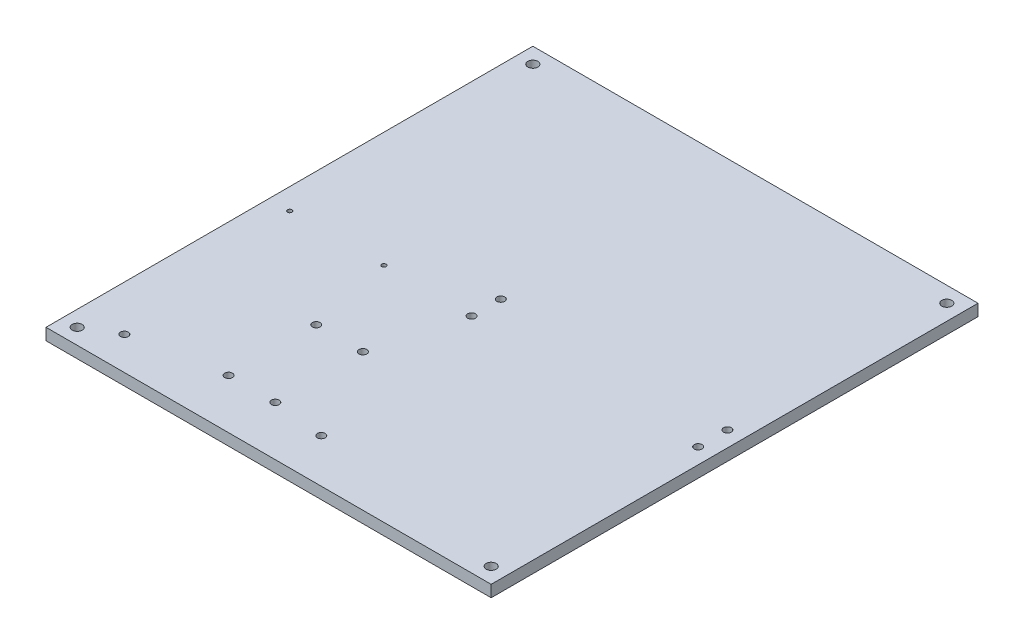
ISO-10303-21;
HEADER;
FILE_DESCRIPTION(('STEP AP214'),'2;1');
FILE_NAME('part.step','',(''),(''),'','','');
FILE_SCHEMA(('AUTOMOTIVE_DESIGN { 1 0 10303 214 1 1 1 1 }'));
ENDSEC;
DATA;
#1=APPLICATION_CONTEXT('core data for automotive mechanical design processes');
#2=APPLICATION_PROTOCOL_DEFINITION('international standard','automotive_design',2000,#1);
#3=PRODUCT_CONTEXT('',#1,'mechanical');
#4=PRODUCT('Part','Part','',(#3));
#5=PRODUCT_RELATED_PRODUCT_CATEGORY('part','',(#4));
#6=PRODUCT_DEFINITION_FORMATION('','',#4);
#7=PRODUCT_DEFINITION_CONTEXT('part definition',#1,'design');
#8=PRODUCT_DEFINITION('design','',#6,#7);
#9=PRODUCT_DEFINITION_SHAPE('','',#8);
#10=(LENGTH_UNIT() NAMED_UNIT(*) SI_UNIT(.MILLI.,.METRE.));
#11=(NAMED_UNIT(*) PLANE_ANGLE_UNIT() SI_UNIT($,.RADIAN.));
#12=(NAMED_UNIT(*) SI_UNIT($,.STERADIAN.) SOLID_ANGLE_UNIT());
#13=UNCERTAINTY_MEASURE_WITH_UNIT(LENGTH_MEASURE(1.E-05),#10,'distance_accuracy_value','');
#14=(GEOMETRIC_REPRESENTATION_CONTEXT(3) GLOBAL_UNCERTAINTY_ASSIGNED_CONTEXT((#13)) GLOBAL_UNIT_ASSIGNED_CONTEXT((#10,
#11,#12)) REPRESENTATION_CONTEXT('',''));
#15=CARTESIAN_POINT('',(0.,0.,0.));
#16=DIRECTION('',(0.,0.,1.));
#17=DIRECTION('',(1.,0.,0.));
#18=AXIS2_PLACEMENT_3D('',#15,#16,#17);
#19=CARTESIAN_POINT('',(-46.0499999999999,-3.,99.5));
#20=DIRECTION('',(0.,1.,0.));
#21=DIRECTION('',(0.,0.,1.));
#22=AXIS2_PLACEMENT_3D('',#19,#20,#21);
#23=CYLINDRICAL_SURFACE('',#22,2.);
#24=CARTESIAN_POINT('',(-46.0499999999999,-3.,99.5));
#25=DIRECTION('',(0.,1.,0.));
#26=DIRECTION('',(0.,0.,1.));
#27=AXIS2_PLACEMENT_3D('',#24,#25,#26);
#28=CIRCLE('',#27,2.);
#29=CARTESIAN_POINT('',(-46.0499999999999,-3.,101.5));
#30=VERTEX_POINT('',#29);
#31=EDGE_CURVE('E44',#30,#30,#28,.T.);
#32=ORIENTED_EDGE('',*,*,#31,.F.);
#33=EDGE_LOOP('',(#32));
#34=FACE_BOUND('',#33,.T.);
#35=CARTESIAN_POINT('',(-46.0499999999999,3.,99.5));
#36=DIRECTION('',(0.,1.,0.));
#37=DIRECTION('',(0.,0.,1.));
#38=AXIS2_PLACEMENT_3D('',#35,#36,#37);
#39=CIRCLE('',#38,2.);
#40=CARTESIAN_POINT('',(-46.0499999999999,3.,101.5));
#41=VERTEX_POINT('',#40);
#42=EDGE_CURVE('E11',#41,#41,#39,.T.);
#43=ORIENTED_EDGE('',*,*,#42,.T.);
#44=EDGE_LOOP('',(#43));
#45=FACE_BOUND('',#44,.T.);
#46=ADVANCED_FACE('F35',(#34,#45),#23,.F.);
#47=CARTESIAN_POINT('',(-22.0499999999999,-3.,99.5));
#48=DIRECTION('',(0.,1.,0.));
#49=DIRECTION('',(0.,0.,1.));
#50=AXIS2_PLACEMENT_3D('',#47,#48,#49);
#51=CYLINDRICAL_SURFACE('',#50,2.);
#52=CARTESIAN_POINT('',(-22.0499999999999,-3.,99.5));
#53=DIRECTION('',(0.,1.,0.));
#54=DIRECTION('',(0.,0.,1.));
#55=AXIS2_PLACEMENT_3D('',#52,#53,#54);
#56=CIRCLE('',#55,2.);
#57=CARTESIAN_POINT('',(-22.0499999999999,-3.,101.5));
#58=VERTEX_POINT('',#57);
#59=EDGE_CURVE('E115',#58,#58,#56,.T.);
#60=ORIENTED_EDGE('',*,*,#59,.F.);
#61=EDGE_LOOP('',(#60));
#62=FACE_BOUND('',#61,.T.);
#63=CARTESIAN_POINT('',(-22.0499999999999,3.,99.5));
#64=DIRECTION('',(0.,1.,0.));
#65=DIRECTION('',(0.,0.,1.));
#66=AXIS2_PLACEMENT_3D('',#63,#64,#65);
#67=CIRCLE('',#66,2.);
#68=CARTESIAN_POINT('',(-22.0499999999999,3.,101.5));
#69=VERTEX_POINT('',#68);
#70=EDGE_CURVE('E118',#69,#69,#67,.T.);
#71=ORIENTED_EDGE('',*,*,#70,.T.);
#72=EDGE_LOOP('',(#71));
#73=FACE_BOUND('',#72,.T.);
#74=ADVANCED_FACE('F225',(#62,#73),#51,.F.);
#75=CARTESIAN_POINT('',(-114.3,3.,-125.));
#76=DIRECTION('',(1.,0.,0.));
#77=DIRECTION('',(0.,0.,-1.));
#78=AXIS2_PLACEMENT_3D('',#75,#76,#77);
#79=PLANE('',#78);
#80=DIRECTION('',(0.,0.,1.));
#81=VECTOR('',#80,1.);
#82=CARTESIAN_POINT('',(-114.3,-3.,-125.));
#83=LINE('',#82,#81);
#84=CARTESIAN_POINT('',(-114.3,-3.,-125.));
#85=VERTEX_POINT('',#84);
#86=CARTESIAN_POINT('',(-114.3,-3.,125.));
#87=VERTEX_POINT('',#86);
#88=EDGE_CURVE('E105',#85,#87,#83,.T.);
#89=ORIENTED_EDGE('',*,*,#88,.T.);
#90=DIRECTION('',(0.,-1.,0.));
#91=VECTOR('',#90,1.);
#92=CARTESIAN_POINT('',(-114.3,3.,125.));
#93=LINE('',#92,#91);
#94=CARTESIAN_POINT('',(-114.3,3.,125.));
#95=VERTEX_POINT('',#94);
#96=EDGE_CURVE('E96',#95,#87,#93,.T.);
#97=ORIENTED_EDGE('',*,*,#96,.F.);
#98=DIRECTION('',(0.,0.,1.));
#99=VECTOR('',#98,1.);
#100=CARTESIAN_POINT('',(-114.3,3.,-125.));
#101=LINE('',#100,#99);
#102=CARTESIAN_POINT('',(-114.3,3.,-125.));
#103=VERTEX_POINT('',#102);
#104=EDGE_CURVE('E90',#103,#95,#101,.T.);
#105=ORIENTED_EDGE('',*,*,#104,.F.);
#106=DIRECTION('',(0.,-1.,0.));
#107=VECTOR('',#106,1.);
#108=CARTESIAN_POINT('',(-114.3,3.,-125.));
#109=LINE('',#108,#107);
#110=EDGE_CURVE('E101',#103,#85,#109,.T.);
#111=ORIENTED_EDGE('',*,*,#110,.T.);
#112=EDGE_LOOP('',(#89,#97,#105,#111));
#113=FACE_BOUND('',#112,.T.);
#114=ADVANCED_FACE('F230',(#113),#79,.F.);
#115=CARTESIAN_POINT('',(-114.3,3.,125.));
#116=DIRECTION('',(0.,0.,-1.));
#117=DIRECTION('',(-1.,0.,0.));
#118=AXIS2_PLACEMENT_3D('',#115,#116,#117);
#119=PLANE('',#118);
#120=DIRECTION('',(1.,0.,0.));
#121=VECTOR('',#120,1.);
#122=CARTESIAN_POINT('',(-114.3,-3.,125.));
#123=LINE('',#122,#121);
#124=CARTESIAN_POINT('',(114.3,-3.,125.));
#125=VERTEX_POINT('',#124);
#126=EDGE_CURVE('E95',#87,#125,#123,.T.);
#127=ORIENTED_EDGE('',*,*,#126,.T.);
#128=DIRECTION('',(0.,-1.,0.));
#129=VECTOR('',#128,1.);
#130=CARTESIAN_POINT('',(114.3,3.,125.));
#131=LINE('',#130,#129);
#132=CARTESIAN_POINT('',(114.3,3.,125.));
#133=VERTEX_POINT('',#132);
#134=EDGE_CURVE('E93',#133,#125,#131,.T.);
#135=ORIENTED_EDGE('',*,*,#134,.F.);
#136=DIRECTION('',(1.,0.,0.));
#137=VECTOR('',#136,1.);
#138=CARTESIAN_POINT('',(-114.3,3.,125.));
#139=LINE('',#138,#137);
#140=EDGE_CURVE('E84',#95,#133,#139,.T.);
#141=ORIENTED_EDGE('',*,*,#140,.F.);
#142=ORIENTED_EDGE('',*,*,#96,.T.);
#143=EDGE_LOOP('',(#127,#135,#141,#142));
#144=FACE_BOUND('',#143,.T.);
#145=ADVANCED_FACE('F94',(#144),#119,.F.);
#146=CARTESIAN_POINT('',(114.3,3.,-125.));
#147=DIRECTION('',(-1.,0.,0.));
#148=DIRECTION('',(0.,0.,1.));
#149=AXIS2_PLACEMENT_3D('',#146,#147,#148);
#150=PLANE('',#149);
#151=DIRECTION('',(0.,0.,-1.));
#152=VECTOR('',#151,1.);
#153=CARTESIAN_POINT('',(114.3,-3.,-125.));
#154=LINE('',#153,#152);
#155=CARTESIAN_POINT('',(114.3,-3.,-125.));
#156=VERTEX_POINT('',#155);
#157=EDGE_CURVE('E70',#125,#156,#154,.T.);
#158=ORIENTED_EDGE('',*,*,#157,.T.);
#159=DIRECTION('',(0.,-1.,0.));
#160=VECTOR('',#159,1.);
#161=CARTESIAN_POINT('',(114.3,3.,-125.));
#162=LINE('',#161,#160);
#163=CARTESIAN_POINT('',(114.3,3.,-125.));
#164=VERTEX_POINT('',#163);
#165=EDGE_CURVE('E97',#164,#156,#162,.T.);
#166=ORIENTED_EDGE('',*,*,#165,.F.);
#167=DIRECTION('',(0.,0.,-1.));
#168=VECTOR('',#167,1.);
#169=CARTESIAN_POINT('',(114.3,3.,-125.));
#170=LINE('',#169,#168);
#171=EDGE_CURVE('E88',#133,#164,#170,.T.);
#172=ORIENTED_EDGE('',*,*,#171,.F.);
#173=ORIENTED_EDGE('',*,*,#134,.T.);
#174=EDGE_LOOP('',(#158,#166,#172,#173));
#175=FACE_BOUND('',#174,.T.);
#176=ADVANCED_FACE('F99',(#175),#150,.F.);
#177=CARTESIAN_POINT('',(-114.3,3.,-125.));
#178=DIRECTION('',(0.,0.,1.));
#179=DIRECTION('',(1.,0.,0.));
#180=AXIS2_PLACEMENT_3D('',#177,#178,#179);
#181=PLANE('',#180);
#182=DIRECTION('',(-1.,0.,0.));
#183=VECTOR('',#182,1.);
#184=CARTESIAN_POINT('',(-114.3,-3.,-125.));
#185=LINE('',#184,#183);
#186=EDGE_CURVE('E76',#156,#85,#185,.T.);
#187=ORIENTED_EDGE('',*,*,#186,.T.);
#188=ORIENTED_EDGE('',*,*,#110,.F.);
#189=DIRECTION('',(-1.,0.,0.));
#190=VECTOR('',#189,1.);
#191=CARTESIAN_POINT('',(-114.3,3.,-125.));
#192=LINE('',#191,#190);
#193=EDGE_CURVE('E53',#164,#103,#192,.T.);
#194=ORIENTED_EDGE('',*,*,#193,.F.);
#195=ORIENTED_EDGE('',*,*,#165,.T.);
#196=EDGE_LOOP('',(#187,#188,#194,#195));
#197=FACE_BOUND('',#196,.T.);
#198=ADVANCED_FACE('F212',(#197),#181,.F.);
#199=CARTESIAN_POINT('',(0.,3.,0.));
#200=DIRECTION('',(0.,1.,0.));
#201=DIRECTION('',(0.,0.,1.));
#202=AXIS2_PLACEMENT_3D('',#199,#200,#201);
#203=PLANE('',#202);
#204=CARTESIAN_POINT('',(-103.45,3.,10.7));
#205=DIRECTION('',(0.,1.,0.));
#206=DIRECTION('',(0.,0.,1.));
#207=AXIS2_PLACEMENT_3D('',#204,#205,#206);
#208=CIRCLE('',#207,1.1303);
#209=CARTESIAN_POINT('',(-103.45,3.,11.8303));
#210=VERTEX_POINT('',#209);
#211=EDGE_CURVE('E124',#210,#210,#208,.T.);
#212=ORIENTED_EDGE('',*,*,#211,.F.);
#213=EDGE_LOOP('',(#212));
#214=FACE_BOUND('',#213,.T.);
#215=CARTESIAN_POINT('',(-55.0499999999999,3.,10.7));
#216=DIRECTION('',(0.,1.,0.));
#217=DIRECTION('',(0.,0.,1.));
#218=AXIS2_PLACEMENT_3D('',#215,#216,#217);
#219=CIRCLE('',#218,1.1303);
#220=CARTESIAN_POINT('',(-55.0499999999999,3.,11.8303));
#221=VERTEX_POINT('',#220);
#222=EDGE_CURVE('E130',#221,#221,#219,.T.);
#223=ORIENTED_EDGE('',*,*,#222,.F.);
#224=EDGE_LOOP('',(#223));
#225=FACE_BOUND('',#224,.T.);
#226=CARTESIAN_POINT('',(-106.3,3.,-117.));
#227=DIRECTION('',(0.,1.,0.));
#228=DIRECTION('',(0.,0.,1.));
#229=AXIS2_PLACEMENT_3D('',#226,#227,#228);
#230=CIRCLE('',#229,2.58);
#231=CARTESIAN_POINT('',(-106.3,3.,-114.42));
#232=VERTEX_POINT('',#231);
#233=EDGE_CURVE('E128',#232,#232,#230,.T.);
#234=ORIENTED_EDGE('',*,*,#233,.F.);
#235=EDGE_LOOP('',(#234));
#236=FACE_BOUND('',#235,.T.);
#237=CARTESIAN_POINT('',(106.3,3.,-117.));
#238=DIRECTION('',(0.,1.,0.));
#239=DIRECTION('',(0.,0.,1.));
#240=AXIS2_PLACEMENT_3D('',#237,#238,#239);
#241=CIRCLE('',#240,2.58);
#242=CARTESIAN_POINT('',(106.3,3.,-114.42));
#243=VERTEX_POINT('',#242);
#244=EDGE_CURVE('E147',#243,#243,#241,.T.);
#245=ORIENTED_EDGE('',*,*,#244,.F.);
#246=EDGE_LOOP('',(#245));
#247=FACE_BOUND('',#246,.T.);
#248=CARTESIAN_POINT('',(106.3,3.,117.));
#249=DIRECTION('',(0.,1.,0.));
#250=DIRECTION('',(0.,0.,1.));
#251=AXIS2_PLACEMENT_3D('',#248,#249,#250);
#252=CIRCLE('',#251,2.58);
#253=CARTESIAN_POINT('',(106.3,3.,119.58));
#254=VERTEX_POINT('',#253);
#255=EDGE_CURVE('E141',#254,#254,#252,.T.);
#256=ORIENTED_EDGE('',*,*,#255,.F.);
#257=EDGE_LOOP('',(#256));
#258=FACE_BOUND('',#257,.T.);
#259=CARTESIAN_POINT('',(-106.3,3.,117.));
#260=DIRECTION('',(0.,1.,0.));
#261=DIRECTION('',(0.,0.,1.));
#262=AXIS2_PLACEMENT_3D('',#259,#260,#261);
#263=CIRCLE('',#262,2.58);
#264=CARTESIAN_POINT('',(-106.3,3.,119.58));
#265=VERTEX_POINT('',#264);
#266=EDGE_CURVE('E140',#265,#265,#263,.T.);
#267=ORIENTED_EDGE('',*,*,#266,.F.);
#268=EDGE_LOOP('',(#267));
#269=FACE_BOUND('',#268,.T.);
#270=CARTESIAN_POINT('',(-91.0499999999999,3.,108.));
#271=DIRECTION('',(0.,1.,0.));
#272=DIRECTION('',(0.,0.,1.));
#273=AXIS2_PLACEMENT_3D('',#270,#271,#272);
#274=CIRCLE('',#273,2.);
#275=CARTESIAN_POINT('',(-91.0499999999999,3.,110.));
#276=VERTEX_POINT('',#275);
#277=EDGE_CURVE('E158',#276,#276,#274,.T.);
#278=ORIENTED_EDGE('',*,*,#277,.F.);
#279=EDGE_LOOP('',(#278));
#280=FACE_BOUND('',#279,.T.);
#281=CARTESIAN_POINT('',(4.55000000000005,3.,102.5));
#282=DIRECTION('',(0.,1.,0.));
#283=DIRECTION('',(0.,0.,1.));
#284=AXIS2_PLACEMENT_3D('',#281,#282,#283);
#285=CIRCLE('',#284,2.);
#286=CARTESIAN_POINT('',(4.55000000000005,3.,104.5));
#287=VERTEX_POINT('',#286);
#288=EDGE_CURVE('E164',#287,#287,#285,.T.);
#289=ORIENTED_EDGE('',*,*,#288,.F.);
#290=EDGE_LOOP('',(#289));
#291=FACE_BOUND('',#290,.T.);
#292=CARTESIAN_POINT('',(-46.0499999999999,3.,54.5));
#293=DIRECTION('',(0.,1.,0.));
#294=DIRECTION('',(0.,0.,1.));
#295=AXIS2_PLACEMENT_3D('',#292,#293,#294);
#296=CIRCLE('',#295,2.);
#297=CARTESIAN_POINT('',(-46.0499999999999,3.,56.5));
#298=VERTEX_POINT('',#297);
#299=EDGE_CURVE('E175',#298,#298,#296,.T.);
#300=ORIENTED_EDGE('',*,*,#299,.F.);
#301=EDGE_LOOP('',(#300));
#302=FACE_BOUND('',#301,.T.);
#303=CARTESIAN_POINT('',(-22.0499999999999,3.,54.5));
#304=DIRECTION('',(0.,1.,0.));
#305=DIRECTION('',(0.,0.,1.));
#306=AXIS2_PLACEMENT_3D('',#303,#304,#305);
#307=CIRCLE('',#306,2.);
#308=CARTESIAN_POINT('',(-22.0499999999999,3.,56.5));
#309=VERTEX_POINT('',#308);
#310=EDGE_CURVE('E178',#309,#309,#307,.T.);
#311=ORIENTED_EDGE('',*,*,#310,.F.);
#312=EDGE_LOOP('',(#311));
#313=FACE_BOUND('',#312,.T.);
#314=CARTESIAN_POINT('',(-10.0499999999999,3.,10.7));
#315=DIRECTION('',(0.,1.,0.));
#316=DIRECTION('',(0.,0.,1.));
#317=AXIS2_PLACEMENT_3D('',#314,#315,#316);
#318=CIRCLE('',#317,2.);
#319=CARTESIAN_POINT('',(-10.0499999999999,3.,12.7));
#320=VERTEX_POINT('',#319);
#321=EDGE_CURVE('E189',#320,#320,#318,.T.);
#322=ORIENTED_EDGE('',*,*,#321,.F.);
#323=EDGE_LOOP('',(#322));
#324=FACE_BOUND('',#323,.T.);
#325=CARTESIAN_POINT('',(-10.0499999999999,3.,-4.3));
#326=DIRECTION('',(0.,1.,0.));
#327=DIRECTION('',(0.,0.,1.));
#328=AXIS2_PLACEMENT_3D('',#325,#326,#327);
#329=CIRCLE('',#328,2.);
#330=CARTESIAN_POINT('',(-10.0499999999999,3.,-2.3));
#331=VERTEX_POINT('',#330);
#332=EDGE_CURVE('E182',#331,#331,#329,.T.);
#333=ORIENTED_EDGE('',*,*,#332,.F.);
#334=EDGE_LOOP('',(#333));
#335=FACE_BOUND('',#334,.T.);
#336=CARTESIAN_POINT('',(106.3,3.,10.7));
#337=DIRECTION('',(0.,1.,0.));
#338=DIRECTION('',(0.,0.,1.));
#339=AXIS2_PLACEMENT_3D('',#336,#337,#338);
#340=CIRCLE('',#339,2.);
#341=CARTESIAN_POINT('',(106.3,3.,12.7));
#342=VERTEX_POINT('',#341);
#343=EDGE_CURVE('E199',#342,#342,#340,.T.);
#344=ORIENTED_EDGE('',*,*,#343,.F.);
#345=EDGE_LOOP('',(#344));
#346=FACE_BOUND('',#345,.T.);
#347=CARTESIAN_POINT('',(106.3,3.,-4.3));
#348=DIRECTION('',(0.,1.,0.));
#349=DIRECTION('',(0.,0.,1.));
#350=AXIS2_PLACEMENT_3D('',#347,#348,#349);
#351=CIRCLE('',#350,2.);
#352=CARTESIAN_POINT('',(106.3,3.,-2.3));
#353=VERTEX_POINT('',#352);
#354=EDGE_CURVE('E188',#353,#353,#351,.T.);
#355=ORIENTED_EDGE('',*,*,#354,.F.);
#356=EDGE_LOOP('',(#355));
#357=FACE_BOUND('',#356,.T.);
#358=ORIENTED_EDGE('',*,*,#104,.T.);
#359=ORIENTED_EDGE('',*,*,#140,.T.);
#360=ORIENTED_EDGE('',*,*,#171,.T.);
#361=ORIENTED_EDGE('',*,*,#193,.T.);
#362=EDGE_LOOP('',(#358,#359,#360,#361));
#363=FACE_BOUND('',#362,.T.);
#364=ORIENTED_EDGE('',*,*,#70,.F.);
#365=EDGE_LOOP('',(#364));
#366=FACE_BOUND('',#365,.T.);
#367=ORIENTED_EDGE('',*,*,#42,.F.);
#368=EDGE_LOOP('',(#367));
#369=FACE_BOUND('',#368,.T.);
#370=ADVANCED_FACE('F85',(#214,#225,#236,#247,#258,#269,#280,#291,#302,#313,#324,#335,#346,#357,
#363,#366,#369),#203,.T.);
#371=CARTESIAN_POINT('',(0.,-3.,0.));
#372=DIRECTION('',(0.,1.,0.));
#373=DIRECTION('',(0.,0.,1.));
#374=AXIS2_PLACEMENT_3D('',#371,#372,#373);
#375=PLANE('',#374);
#376=CARTESIAN_POINT('',(-103.45,-3.,10.7));
#377=DIRECTION('',(0.,1.,0.));
#378=DIRECTION('',(0.,0.,1.));
#379=AXIS2_PLACEMENT_3D('',#376,#377,#378);
#380=CIRCLE('',#379,1.1303);
#381=CARTESIAN_POINT('',(-103.45,-3.,11.8303));
#382=VERTEX_POINT('',#381);
#383=EDGE_CURVE('E38',#382,#382,#380,.T.);
#384=ORIENTED_EDGE('',*,*,#383,.T.);
#385=EDGE_LOOP('',(#384));
#386=FACE_BOUND('',#385,.T.);
#387=CARTESIAN_POINT('',(-55.0499999999999,-3.,10.7));
#388=DIRECTION('',(0.,1.,0.));
#389=DIRECTION('',(0.,0.,1.));
#390=AXIS2_PLACEMENT_3D('',#387,#388,#389);
#391=CIRCLE('',#390,1.1303);
#392=CARTESIAN_POINT('',(-55.0499999999999,-3.,11.8303));
#393=VERTEX_POINT('',#392);
#394=EDGE_CURVE('E122',#393,#393,#391,.T.);
#395=ORIENTED_EDGE('',*,*,#394,.T.);
#396=EDGE_LOOP('',(#395));
#397=FACE_BOUND('',#396,.T.);
#398=CARTESIAN_POINT('',(-106.3,-3.,-117.));
#399=DIRECTION('',(0.,1.,0.));
#400=DIRECTION('',(0.,0.,1.));
#401=AXIS2_PLACEMENT_3D('',#398,#399,#400);
#402=CIRCLE('',#401,2.58);
#403=CARTESIAN_POINT('',(-106.3,-3.,-114.42));
#404=VERTEX_POINT('',#403);
#405=EDGE_CURVE('E150',#404,#404,#402,.T.);
#406=ORIENTED_EDGE('',*,*,#405,.T.);
#407=EDGE_LOOP('',(#406));
#408=FACE_BOUND('',#407,.T.);
#409=CARTESIAN_POINT('',(106.3,-3.,-117.));
#410=DIRECTION('',(0.,1.,0.));
#411=DIRECTION('',(0.,0.,1.));
#412=AXIS2_PLACEMENT_3D('',#409,#410,#411);
#413=CIRCLE('',#412,2.58);
#414=CARTESIAN_POINT('',(106.3,-3.,-114.42));
#415=VERTEX_POINT('',#414);
#416=EDGE_CURVE('E144',#415,#415,#413,.T.);
#417=ORIENTED_EDGE('',*,*,#416,.T.);
#418=EDGE_LOOP('',(#417));
#419=FACE_BOUND('',#418,.T.);
#420=CARTESIAN_POINT('',(106.3,-3.,117.));
#421=DIRECTION('',(0.,1.,0.));
#422=DIRECTION('',(0.,0.,1.));
#423=AXIS2_PLACEMENT_3D('',#420,#421,#422);
#424=CIRCLE('',#423,2.58);
#425=CARTESIAN_POINT('',(106.3,-3.,119.58));
#426=VERTEX_POINT('',#425);
#427=EDGE_CURVE('E137',#426,#426,#424,.T.);
#428=ORIENTED_EDGE('',*,*,#427,.T.);
#429=EDGE_LOOP('',(#428));
#430=FACE_BOUND('',#429,.T.);
#431=CARTESIAN_POINT('',(-106.3,-3.,117.));
#432=DIRECTION('',(0.,1.,0.));
#433=DIRECTION('',(0.,0.,1.));
#434=AXIS2_PLACEMENT_3D('',#431,#432,#433);
#435=CIRCLE('',#434,2.58);
#436=CARTESIAN_POINT('',(-106.3,-3.,119.58));
#437=VERTEX_POINT('',#436);
#438=EDGE_CURVE('E155',#437,#437,#435,.T.);
#439=ORIENTED_EDGE('',*,*,#438,.T.);
#440=EDGE_LOOP('',(#439));
#441=FACE_BOUND('',#440,.T.);
#442=CARTESIAN_POINT('',(-91.0499999999999,-3.,108.));
#443=DIRECTION('',(0.,1.,0.));
#444=DIRECTION('',(0.,0.,1.));
#445=AXIS2_PLACEMENT_3D('',#442,#443,#444);
#446=CIRCLE('',#445,2.);
#447=CARTESIAN_POINT('',(-91.0499999999999,-3.,110.));
#448=VERTEX_POINT('',#447);
#449=EDGE_CURVE('E161',#448,#448,#446,.T.);
#450=ORIENTED_EDGE('',*,*,#449,.T.);
#451=EDGE_LOOP('',(#450));
#452=FACE_BOUND('',#451,.T.);
#453=CARTESIAN_POINT('',(4.55000000000005,-3.,102.5));
#454=DIRECTION('',(0.,1.,0.));
#455=DIRECTION('',(0.,0.,1.));
#456=AXIS2_PLACEMENT_3D('',#453,#454,#455);
#457=CIRCLE('',#456,2.);
#458=CARTESIAN_POINT('',(4.55000000000005,-3.,104.5));
#459=VERTEX_POINT('',#458);
#460=EDGE_CURVE('E167',#459,#459,#457,.T.);
#461=ORIENTED_EDGE('',*,*,#460,.T.);
#462=EDGE_LOOP('',(#461));
#463=FACE_BOUND('',#462,.T.);
#464=CARTESIAN_POINT('',(-46.0499999999999,-3.,54.5));
#465=DIRECTION('',(0.,1.,0.));
#466=DIRECTION('',(0.,0.,1.));
#467=AXIS2_PLACEMENT_3D('',#464,#465,#466);
#468=CIRCLE('',#467,2.);
#469=CARTESIAN_POINT('',(-46.0499999999999,-3.,56.5));
#470=VERTEX_POINT('',#469);
#471=EDGE_CURVE('E170',#470,#470,#468,.T.);
#472=ORIENTED_EDGE('',*,*,#471,.T.);
#473=EDGE_LOOP('',(#472));
#474=FACE_BOUND('',#473,.T.);
#475=CARTESIAN_POINT('',(-22.0499999999999,-3.,54.5));
#476=DIRECTION('',(0.,1.,0.));
#477=DIRECTION('',(0.,0.,1.));
#478=AXIS2_PLACEMENT_3D('',#475,#476,#477);
#479=CIRCLE('',#478,2.);
#480=CARTESIAN_POINT('',(-22.0499999999999,-3.,56.5));
#481=VERTEX_POINT('',#480);
#482=EDGE_CURVE('E179',#481,#481,#479,.T.);
#483=ORIENTED_EDGE('',*,*,#482,.T.);
#484=EDGE_LOOP('',(#483));
#485=FACE_BOUND('',#484,.T.);
#486=CARTESIAN_POINT('',(-10.0499999999999,-3.,10.7));
#487=DIRECTION('',(0.,1.,0.));
#488=DIRECTION('',(0.,0.,1.));
#489=AXIS2_PLACEMENT_3D('',#486,#487,#488);
#490=CIRCLE('',#489,2.);
#491=CARTESIAN_POINT('',(-10.0499999999999,-3.,12.7));
#492=VERTEX_POINT('',#491);
#493=EDGE_CURVE('E185',#492,#492,#490,.T.);
#494=ORIENTED_EDGE('',*,*,#493,.T.);
#495=EDGE_LOOP('',(#494));
#496=FACE_BOUND('',#495,.T.);
#497=CARTESIAN_POINT('',(-10.0499999999999,-3.,-4.3));
#498=DIRECTION('',(0.,1.,0.));
#499=DIRECTION('',(0.,0.,1.));
#500=AXIS2_PLACEMENT_3D('',#497,#498,#499);
#501=CIRCLE('',#500,2.);
#502=CARTESIAN_POINT('',(-10.0499999999999,-3.,-2.3));
#503=VERTEX_POINT('',#502);
#504=EDGE_CURVE('E192',#503,#503,#501,.T.);
#505=ORIENTED_EDGE('',*,*,#504,.T.);
#506=EDGE_LOOP('',(#505));
#507=FACE_BOUND('',#506,.T.);
#508=CARTESIAN_POINT('',(106.3,-3.,10.7));
#509=DIRECTION('',(0.,1.,0.));
#510=DIRECTION('',(0.,0.,1.));
#511=AXIS2_PLACEMENT_3D('',#508,#509,#510);
#512=CIRCLE('',#511,2.);
#513=CARTESIAN_POINT('',(106.3,-3.,12.7));
#514=VERTEX_POINT('',#513);
#515=EDGE_CURVE('E108',#514,#514,#512,.T.);
#516=ORIENTED_EDGE('',*,*,#515,.T.);
#517=EDGE_LOOP('',(#516));
#518=FACE_BOUND('',#517,.T.);
#519=CARTESIAN_POINT('',(106.3,-3.,-4.3));
#520=DIRECTION('',(0.,1.,0.));
#521=DIRECTION('',(0.,0.,1.));
#522=AXIS2_PLACEMENT_3D('',#519,#520,#521);
#523=CIRCLE('',#522,2.);
#524=CARTESIAN_POINT('',(106.3,-3.,-2.3));
#525=VERTEX_POINT('',#524);
#526=EDGE_CURVE('E202',#525,#525,#523,.T.);
#527=ORIENTED_EDGE('',*,*,#526,.T.);
#528=EDGE_LOOP('',(#527));
#529=FACE_BOUND('',#528,.T.);
#530=ORIENTED_EDGE('',*,*,#88,.F.);
#531=ORIENTED_EDGE('',*,*,#186,.F.);
#532=ORIENTED_EDGE('',*,*,#157,.F.);
#533=ORIENTED_EDGE('',*,*,#126,.F.);
#534=EDGE_LOOP('',(#530,#531,#532,#533));
#535=FACE_BOUND('',#534,.T.);
#536=ORIENTED_EDGE('',*,*,#59,.T.);
#537=EDGE_LOOP('',(#536));
#538=FACE_BOUND('',#537,.T.);
#539=ORIENTED_EDGE('',*,*,#31,.T.);
#540=EDGE_LOOP('',(#539));
#541=FACE_BOUND('',#540,.T.);
#542=ADVANCED_FACE('F211',(#386,#397,#408,#419,#430,#441,#452,#463,#474,#485,#496,#507,#518,
#529,#535,#538,#541),#375,.F.);
#543=CARTESIAN_POINT('',(106.3,-3.,-4.3));
#544=DIRECTION('',(0.,1.,0.));
#545=DIRECTION('',(0.,0.,1.));
#546=AXIS2_PLACEMENT_3D('',#543,#544,#545);
#547=CYLINDRICAL_SURFACE('',#546,2.);
#548=ORIENTED_EDGE('',*,*,#526,.F.);
#549=EDGE_LOOP('',(#548));
#550=FACE_BOUND('',#549,.T.);
#551=ORIENTED_EDGE('',*,*,#354,.T.);
#552=EDGE_LOOP('',(#551));
#553=FACE_BOUND('',#552,.T.);
#554=ADVANCED_FACE('F208',(#550,#553),#547,.F.);
#555=CARTESIAN_POINT('',(106.3,-3.,10.7));
#556=DIRECTION('',(0.,1.,0.));
#557=DIRECTION('',(0.,0.,1.));
#558=AXIS2_PLACEMENT_3D('',#555,#556,#557);
#559=CYLINDRICAL_SURFACE('',#558,2.);
#560=ORIENTED_EDGE('',*,*,#515,.F.);
#561=EDGE_LOOP('',(#560));
#562=FACE_BOUND('',#561,.T.);
#563=ORIENTED_EDGE('',*,*,#343,.T.);
#564=EDGE_LOOP('',(#563));
#565=FACE_BOUND('',#564,.T.);
#566=ADVANCED_FACE('F266',(#562,#565),#559,.F.);
#567=CARTESIAN_POINT('',(-10.0499999999999,-3.,-4.3));
#568=DIRECTION('',(0.,1.,0.));
#569=DIRECTION('',(0.,0.,1.));
#570=AXIS2_PLACEMENT_3D('',#567,#568,#569);
#571=CYLINDRICAL_SURFACE('',#570,2.);
#572=ORIENTED_EDGE('',*,*,#504,.F.);
#573=EDGE_LOOP('',(#572));
#574=FACE_BOUND('',#573,.T.);
#575=ORIENTED_EDGE('',*,*,#332,.T.);
#576=EDGE_LOOP('',(#575));
#577=FACE_BOUND('',#576,.T.);
#578=ADVANCED_FACE('F276',(#574,#577),#571,.F.);
#579=CARTESIAN_POINT('',(-10.0499999999999,-3.,10.7));
#580=DIRECTION('',(0.,1.,0.));
#581=DIRECTION('',(0.,0.,1.));
#582=AXIS2_PLACEMENT_3D('',#579,#580,#581);
#583=CYLINDRICAL_SURFACE('',#582,2.);
#584=ORIENTED_EDGE('',*,*,#493,.F.);
#585=EDGE_LOOP('',(#584));
#586=FACE_BOUND('',#585,.T.);
#587=ORIENTED_EDGE('',*,*,#321,.T.);
#588=EDGE_LOOP('',(#587));
#589=FACE_BOUND('',#588,.T.);
#590=ADVANCED_FACE('F286',(#586,#589),#583,.F.);
#591=CARTESIAN_POINT('',(-22.0499999999999,-3.,54.5));
#592=DIRECTION('',(0.,1.,0.));
#593=DIRECTION('',(0.,0.,1.));
#594=AXIS2_PLACEMENT_3D('',#591,#592,#593);
#595=CYLINDRICAL_SURFACE('',#594,2.);
#596=ORIENTED_EDGE('',*,*,#482,.F.);
#597=EDGE_LOOP('',(#596));
#598=FACE_BOUND('',#597,.T.);
#599=ORIENTED_EDGE('',*,*,#310,.T.);
#600=EDGE_LOOP('',(#599));
#601=FACE_BOUND('',#600,.T.);
#602=ADVANCED_FACE('F296',(#598,#601),#595,.F.);
#603=CARTESIAN_POINT('',(-46.0499999999999,-3.,54.5));
#604=DIRECTION('',(0.,1.,0.));
#605=DIRECTION('',(0.,0.,1.));
#606=AXIS2_PLACEMENT_3D('',#603,#604,#605);
#607=CYLINDRICAL_SURFACE('',#606,2.);
#608=ORIENTED_EDGE('',*,*,#471,.F.);
#609=EDGE_LOOP('',(#608));
#610=FACE_BOUND('',#609,.T.);
#611=ORIENTED_EDGE('',*,*,#299,.T.);
#612=EDGE_LOOP('',(#611));
#613=FACE_BOUND('',#612,.T.);
#614=ADVANCED_FACE('F305',(#610,#613),#607,.F.);
#615=CARTESIAN_POINT('',(4.55000000000005,-3.,102.5));
#616=DIRECTION('',(0.,1.,0.));
#617=DIRECTION('',(0.,0.,1.));
#618=AXIS2_PLACEMENT_3D('',#615,#616,#617);
#619=CYLINDRICAL_SURFACE('',#618,2.);
#620=ORIENTED_EDGE('',*,*,#460,.F.);
#621=EDGE_LOOP('',(#620));
#622=FACE_BOUND('',#621,.T.);
#623=ORIENTED_EDGE('',*,*,#288,.T.);
#624=EDGE_LOOP('',(#623));
#625=FACE_BOUND('',#624,.T.);
#626=ADVANCED_FACE('F324',(#622,#625),#619,.F.);
#627=CARTESIAN_POINT('',(-91.0499999999999,-3.,108.));
#628=DIRECTION('',(0.,1.,0.));
#629=DIRECTION('',(0.,0.,1.));
#630=AXIS2_PLACEMENT_3D('',#627,#628,#629);
#631=CYLINDRICAL_SURFACE('',#630,2.);
#632=ORIENTED_EDGE('',*,*,#449,.F.);
#633=EDGE_LOOP('',(#632));
#634=FACE_BOUND('',#633,.T.);
#635=ORIENTED_EDGE('',*,*,#277,.T.);
#636=EDGE_LOOP('',(#635));
#637=FACE_BOUND('',#636,.T.);
#638=ADVANCED_FACE('F334',(#634,#637),#631,.F.);
#639=CARTESIAN_POINT('',(-106.3,-3.,117.));
#640=DIRECTION('',(0.,1.,0.));
#641=DIRECTION('',(0.,0.,1.));
#642=AXIS2_PLACEMENT_3D('',#639,#640,#641);
#643=CYLINDRICAL_SURFACE('',#642,2.58);
#644=ORIENTED_EDGE('',*,*,#438,.F.);
#645=EDGE_LOOP('',(#644));
#646=FACE_BOUND('',#645,.T.);
#647=ORIENTED_EDGE('',*,*,#266,.T.);
#648=EDGE_LOOP('',(#647));
#649=FACE_BOUND('',#648,.T.);
#650=ADVANCED_FACE('F344',(#646,#649),#643,.F.);
#651=CARTESIAN_POINT('',(106.3,-3.,117.));
#652=DIRECTION('',(0.,1.,0.));
#653=DIRECTION('',(0.,0.,1.));
#654=AXIS2_PLACEMENT_3D('',#651,#652,#653);
#655=CYLINDRICAL_SURFACE('',#654,2.58);
#656=ORIENTED_EDGE('',*,*,#427,.F.);
#657=EDGE_LOOP('',(#656));
#658=FACE_BOUND('',#657,.T.);
#659=ORIENTED_EDGE('',*,*,#255,.T.);
#660=EDGE_LOOP('',(#659));
#661=FACE_BOUND('',#660,.T.);
#662=ADVANCED_FACE('F354',(#658,#661),#655,.F.);
#663=CARTESIAN_POINT('',(106.3,-3.,-117.));
#664=DIRECTION('',(0.,1.,0.));
#665=DIRECTION('',(0.,0.,1.));
#666=AXIS2_PLACEMENT_3D('',#663,#664,#665);
#667=CYLINDRICAL_SURFACE('',#666,2.58);
#668=ORIENTED_EDGE('',*,*,#416,.F.);
#669=EDGE_LOOP('',(#668));
#670=FACE_BOUND('',#669,.T.);
#671=ORIENTED_EDGE('',*,*,#244,.T.);
#672=EDGE_LOOP('',(#671));
#673=FACE_BOUND('',#672,.T.);
#674=ADVANCED_FACE('F364',(#670,#673),#667,.F.);
#675=CARTESIAN_POINT('',(-106.3,-3.,-117.));
#676=DIRECTION('',(0.,1.,0.));
#677=DIRECTION('',(0.,0.,1.));
#678=AXIS2_PLACEMENT_3D('',#675,#676,#677);
#679=CYLINDRICAL_SURFACE('',#678,2.58);
#680=ORIENTED_EDGE('',*,*,#405,.F.);
#681=EDGE_LOOP('',(#680));
#682=FACE_BOUND('',#681,.T.);
#683=ORIENTED_EDGE('',*,*,#233,.T.);
#684=EDGE_LOOP('',(#683));
#685=FACE_BOUND('',#684,.T.);
#686=ADVANCED_FACE('F374',(#682,#685),#679,.F.);
#687=CARTESIAN_POINT('',(-55.0499999999999,-7.,10.7));
#688=DIRECTION('',(0.,1.,0.));
#689=DIRECTION('',(0.,0.,1.));
#690=AXIS2_PLACEMENT_3D('',#687,#688,#689);
#691=CYLINDRICAL_SURFACE('',#690,1.1303);
#692=ORIENTED_EDGE('',*,*,#222,.T.);
#693=EDGE_LOOP('',(#692));
#694=FACE_BOUND('',#693,.T.);
#695=ORIENTED_EDGE('',*,*,#394,.F.);
#696=EDGE_LOOP('',(#695));
#697=FACE_BOUND('',#696,.T.);
#698=ADVANCED_FACE('F383',(#694,#697),#691,.F.);
#699=CARTESIAN_POINT('',(-103.45,-7.,10.7));
#700=DIRECTION('',(0.,1.,0.));
#701=DIRECTION('',(0.,0.,1.));
#702=AXIS2_PLACEMENT_3D('',#699,#700,#701);
#703=CYLINDRICAL_SURFACE('',#702,1.1303);
#704=ORIENTED_EDGE('',*,*,#211,.T.);
#705=EDGE_LOOP('',(#704));
#706=FACE_BOUND('',#705,.T.);
#707=ORIENTED_EDGE('',*,*,#383,.F.);
#708=EDGE_LOOP('',(#707));
#709=FACE_BOUND('',#708,.T.);
#710=ADVANCED_FACE('F402',(#706,#709),#703,.F.);
#711=CLOSED_SHELL('',(#46,#74,#114,#145,#176,#198,#370,#542,#554,#566,#578,#590,#602,#614,#626,
#638,#650,#662,#674,#686,#698,#710));
#712=MANIFOLD_SOLID_BREP('B2',#711);
#713=ADVANCED_BREP_SHAPE_REPRESENTATION('',(#18,#712),#14);
#714=SHAPE_DEFINITION_REPRESENTATION(#9,#713);
ENDSEC;
END-ISO-10303-21;
